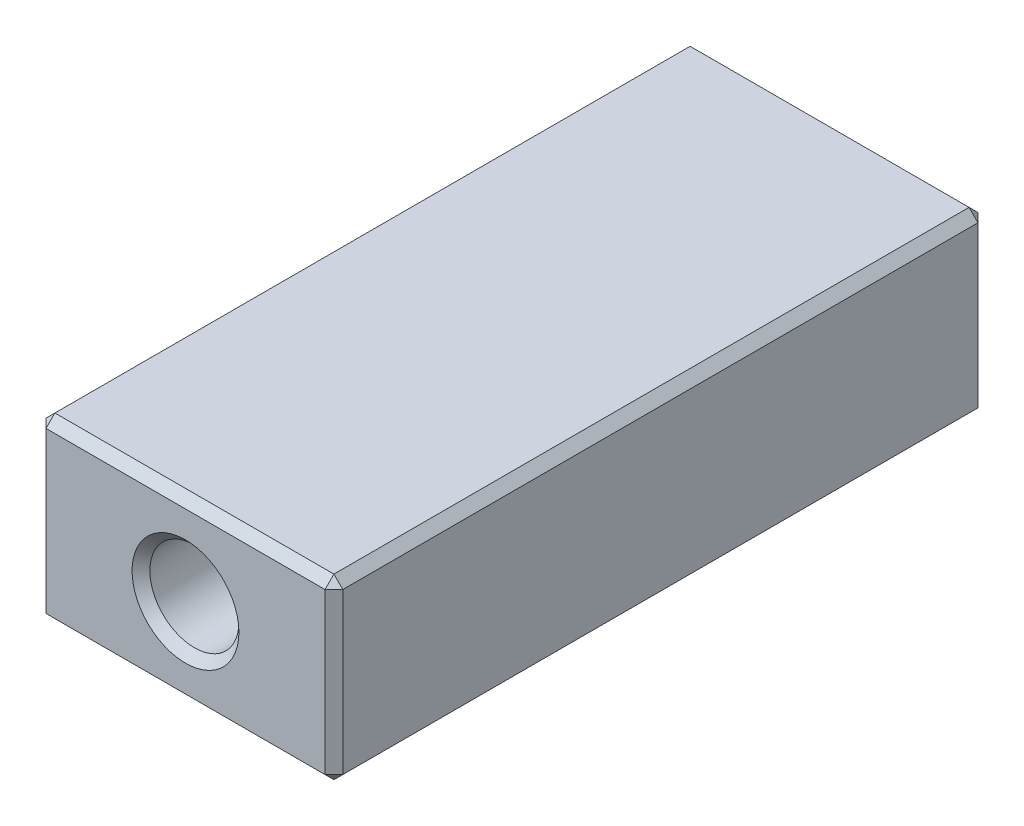
ISO-10303-21;
HEADER;
FILE_DESCRIPTION(('STEP AP214'),'2;1');
FILE_NAME('part.step','',(''),(''),'','','');
FILE_SCHEMA(('AUTOMOTIVE_DESIGN { 1 0 10303 214 1 1 1 1 }'));
ENDSEC;
DATA;
#1=APPLICATION_CONTEXT('core data for automotive mechanical design processes');
#2=APPLICATION_PROTOCOL_DEFINITION('international standard','automotive_design',2000,#1);
#3=PRODUCT_CONTEXT('',#1,'mechanical');
#4=PRODUCT('Part','Part','',(#3));
#5=PRODUCT_RELATED_PRODUCT_CATEGORY('part','',(#4));
#6=PRODUCT_DEFINITION_FORMATION('','',#4);
#7=PRODUCT_DEFINITION_CONTEXT('part definition',#1,'design');
#8=PRODUCT_DEFINITION('design','',#6,#7);
#9=PRODUCT_DEFINITION_SHAPE('','',#8);
#10=(LENGTH_UNIT() NAMED_UNIT(*) SI_UNIT(.MILLI.,.METRE.));
#11=(NAMED_UNIT(*) PLANE_ANGLE_UNIT() SI_UNIT($,.RADIAN.));
#12=(NAMED_UNIT(*) SI_UNIT($,.STERADIAN.) SOLID_ANGLE_UNIT());
#13=UNCERTAINTY_MEASURE_WITH_UNIT(LENGTH_MEASURE(1.E-05),#10,'distance_accuracy_value','');
#14=(GEOMETRIC_REPRESENTATION_CONTEXT(3) GLOBAL_UNCERTAINTY_ASSIGNED_CONTEXT((#13)) GLOBAL_UNIT_ASSIGNED_CONTEXT((#10,
#11,#12)) REPRESENTATION_CONTEXT('',''));
#15=CARTESIAN_POINT('',(0.,0.,0.));
#16=DIRECTION('',(0.,0.,1.));
#17=DIRECTION('',(1.,0.,0.));
#18=AXIS2_PLACEMENT_3D('',#15,#16,#17);
#19=CARTESIAN_POINT('',(5.,3.,22.));
#20=DIRECTION('',(-1.,0.,0.));
#21=DIRECTION('',(0.,-1.,0.));
#22=AXIS2_PLACEMENT_3D('',#19,#20,#21);
#23=PLANE('',#22);
#24=DIRECTION('',(0.,0.,1.));
#25=VECTOR('',#24,1.);
#26=CARTESIAN_POINT('',(5.,2.69999999999999,22.));
#27=LINE('',#26,#25);
#28=CARTESIAN_POINT('',(5.,2.69999999999999,0.300000000000002));
#29=VERTEX_POINT('',#28);
#30=CARTESIAN_POINT('',(5.,2.69999999999999,21.7));
#31=VERTEX_POINT('',#30);
#32=EDGE_CURVE('E185',#29,#31,#27,.T.);
#33=ORIENTED_EDGE('',*,*,#32,.T.);
#34=DIRECTION('',(0.,-1.,0.));
#35=VECTOR('',#34,1.);
#36=CARTESIAN_POINT('',(5.,-3.,21.7));
#37=LINE('',#36,#35);
#38=CARTESIAN_POINT('',(5.,-2.7,21.7));
#39=VERTEX_POINT('',#38);
#40=EDGE_CURVE('E133',#31,#39,#37,.T.);
#41=ORIENTED_EDGE('',*,*,#40,.T.);
#42=DIRECTION('',(0.,0.,-1.));
#43=VECTOR('',#42,1.);
#44=CARTESIAN_POINT('',(5.,-2.7,22.));
#45=LINE('',#44,#43);
#46=CARTESIAN_POINT('',(5.,-2.7,0.300000000000002));
#47=VERTEX_POINT('',#46);
#48=EDGE_CURVE('E189',#39,#47,#45,.T.);
#49=ORIENTED_EDGE('',*,*,#48,.T.);
#50=DIRECTION('',(0.,1.,0.));
#51=VECTOR('',#50,1.);
#52=CARTESIAN_POINT('',(5.,3.,0.300000000000002));
#53=LINE('',#52,#51);
#54=EDGE_CURVE('E187',#47,#29,#53,.T.);
#55=ORIENTED_EDGE('',*,*,#54,.T.);
#56=EDGE_LOOP('',(#33,#41,#49,#55));
#57=FACE_BOUND('',#56,.T.);
#58=ADVANCED_FACE('F36',(#57),#23,.F.);
#59=CARTESIAN_POINT('',(-5.,3.,22.));
#60=DIRECTION('',(0.,-1.,0.));
#61=DIRECTION('',(0.,0.,-1.));
#62=AXIS2_PLACEMENT_3D('',#59,#60,#61);
#63=PLANE('',#62);
#64=DIRECTION('',(1.,0.,0.));
#65=VECTOR('',#64,1.);
#66=CARTESIAN_POINT('',(5.,3.,21.7));
#67=LINE('',#66,#65);
#68=CARTESIAN_POINT('',(-4.7,3.,21.7));
#69=VERTEX_POINT('',#68);
#70=CARTESIAN_POINT('',(4.7,3.,21.7));
#71=VERTEX_POINT('',#70);
#72=EDGE_CURVE('E46',#69,#71,#67,.T.);
#73=ORIENTED_EDGE('',*,*,#72,.T.);
#74=DIRECTION('',(0.,0.,-1.));
#75=VECTOR('',#74,1.);
#76=CARTESIAN_POINT('',(4.7,3.,22.));
#77=LINE('',#76,#75);
#78=CARTESIAN_POINT('',(4.7,3.,0.300000000000002));
#79=VERTEX_POINT('',#78);
#80=EDGE_CURVE('E11',#71,#79,#77,.T.);
#81=ORIENTED_EDGE('',*,*,#80,.T.);
#82=DIRECTION('',(-1.,0.,0.));
#83=VECTOR('',#82,1.);
#84=CARTESIAN_POINT('',(-5.,3.,0.300000000000002));
#85=LINE('',#84,#83);
#86=CARTESIAN_POINT('',(-4.7,3.,0.300000000000002));
#87=VERTEX_POINT('',#86);
#88=EDGE_CURVE('E210',#79,#87,#85,.T.);
#89=ORIENTED_EDGE('',*,*,#88,.T.);
#90=DIRECTION('',(0.,0.,1.));
#91=VECTOR('',#90,1.);
#92=CARTESIAN_POINT('',(-4.7,3.,22.));
#93=LINE('',#92,#91);
#94=EDGE_CURVE('E57',#87,#69,#93,.T.);
#95=ORIENTED_EDGE('',*,*,#94,.T.);
#96=EDGE_LOOP('',(#73,#81,#89,#95));
#97=FACE_BOUND('',#96,.T.);
#98=ADVANCED_FACE('F348',(#97),#63,.F.);
#99=CARTESIAN_POINT('',(-5.,3.,22.));
#100=DIRECTION('',(1.,0.,0.));
#101=DIRECTION('',(0.,1.,0.));
#102=AXIS2_PLACEMENT_3D('',#99,#100,#101);
#103=PLANE('',#102);
#104=DIRECTION('',(0.,0.,1.));
#105=VECTOR('',#104,1.);
#106=CARTESIAN_POINT('',(-5.,-2.7,22.));
#107=LINE('',#106,#105);
#108=CARTESIAN_POINT('',(-5.,-2.7,0.300000000000002));
#109=VERTEX_POINT('',#108);
#110=CARTESIAN_POINT('',(-5.,-2.7,21.7));
#111=VERTEX_POINT('',#110);
#112=EDGE_CURVE('E205',#109,#111,#107,.T.);
#113=ORIENTED_EDGE('',*,*,#112,.T.);
#114=DIRECTION('',(0.,1.,0.));
#115=VECTOR('',#114,1.);
#116=CARTESIAN_POINT('',(-5.,3.,21.7));
#117=LINE('',#116,#115);
#118=CARTESIAN_POINT('',(-5.,2.69999999999999,21.7));
#119=VERTEX_POINT('',#118);
#120=EDGE_CURVE('E207',#111,#119,#117,.T.);
#121=ORIENTED_EDGE('',*,*,#120,.T.);
#122=DIRECTION('',(0.,0.,-1.));
#123=VECTOR('',#122,1.);
#124=CARTESIAN_POINT('',(-5.,2.69999999999999,22.));
#125=LINE('',#124,#123);
#126=CARTESIAN_POINT('',(-5.,2.69999999999999,0.300000000000002));
#127=VERTEX_POINT('',#126);
#128=EDGE_CURVE('E201',#119,#127,#125,.T.);
#129=ORIENTED_EDGE('',*,*,#128,.T.);
#130=DIRECTION('',(0.,-1.,0.));
#131=VECTOR('',#130,1.);
#132=CARTESIAN_POINT('',(-5.,3.,0.300000000000002));
#133=LINE('',#132,#131);
#134=EDGE_CURVE('E203',#127,#109,#133,.T.);
#135=ORIENTED_EDGE('',*,*,#134,.T.);
#136=EDGE_LOOP('',(#113,#121,#129,#135));
#137=FACE_BOUND('',#136,.T.);
#138=ADVANCED_FACE('F296',(#137),#103,.F.);
#139=CARTESIAN_POINT('',(-5.,-3.,22.));
#140=DIRECTION('',(0.,1.,0.));
#141=DIRECTION('',(0.,0.,1.));
#142=AXIS2_PLACEMENT_3D('',#139,#140,#141);
#143=PLANE('',#142);
#144=DIRECTION('',(0.,0.,1.));
#145=VECTOR('',#144,1.);
#146=CARTESIAN_POINT('',(4.69999999999999,-3.,22.));
#147=LINE('',#146,#145);
#148=CARTESIAN_POINT('',(4.69999999999999,-3.,0.300000000000002));
#149=VERTEX_POINT('',#148);
#150=CARTESIAN_POINT('',(4.69999999999999,-3.,21.7));
#151=VERTEX_POINT('',#150);
#152=EDGE_CURVE('E196',#149,#151,#147,.T.);
#153=ORIENTED_EDGE('',*,*,#152,.T.);
#154=DIRECTION('',(-1.,0.,0.));
#155=VECTOR('',#154,1.);
#156=CARTESIAN_POINT('',(-5.,-3.,21.7));
#157=LINE('',#156,#155);
#158=CARTESIAN_POINT('',(-4.7,-3.,21.7));
#159=VERTEX_POINT('',#158);
#160=EDGE_CURVE('E198',#151,#159,#157,.T.);
#161=ORIENTED_EDGE('',*,*,#160,.T.);
#162=DIRECTION('',(0.,0.,-1.));
#163=VECTOR('',#162,1.);
#164=CARTESIAN_POINT('',(-4.7,-3.,22.));
#165=LINE('',#164,#163);
#166=CARTESIAN_POINT('',(-4.7,-3.,0.300000000000002));
#167=VERTEX_POINT('',#166);
#168=EDGE_CURVE('E194',#159,#167,#165,.T.);
#169=ORIENTED_EDGE('',*,*,#168,.T.);
#170=DIRECTION('',(1.,0.,0.));
#171=VECTOR('',#170,1.);
#172=CARTESIAN_POINT('',(-5.,-3.,0.300000000000002));
#173=LINE('',#172,#171);
#174=EDGE_CURVE('E192',#167,#149,#173,.T.);
#175=ORIENTED_EDGE('',*,*,#174,.T.);
#176=EDGE_LOOP('',(#153,#161,#169,#175));
#177=FACE_BOUND('',#176,.T.);
#178=ADVANCED_FACE('F287',(#177),#143,.F.);
#179=CARTESIAN_POINT('',(0.,0.,22.));
#180=DIRECTION('',(0.,0.,1.));
#181=DIRECTION('',(1.,0.,0.));
#182=AXIS2_PLACEMENT_3D('',#179,#180,#181);
#183=PLANE('',#182);
#184=CARTESIAN_POINT('',(0.,0.,22.));
#185=DIRECTION('',(0.,0.,1.));
#186=DIRECTION('',(1.,0.,0.));
#187=AXIS2_PLACEMENT_3D('',#184,#185,#186);
#188=CIRCLE('',#187,1.8);
#189=CARTESIAN_POINT('',(1.8,0.,22.));
#190=VERTEX_POINT('',#189);
#191=EDGE_CURVE('E160',#190,#190,#188,.F.);
#192=ORIENTED_EDGE('',*,*,#191,.T.);
#193=EDGE_LOOP('',(#192));
#194=FACE_BOUND('',#193,.T.);
#195=DIRECTION('',(1.,0.,0.));
#196=VECTOR('',#195,1.);
#197=CARTESIAN_POINT('',(5.,-2.7,22.));
#198=LINE('',#197,#196);
#199=CARTESIAN_POINT('',(-4.7,-2.7,22.));
#200=VERTEX_POINT('',#199);
#201=CARTESIAN_POINT('',(4.7,-2.7,22.));
#202=VERTEX_POINT('',#201);
#203=EDGE_CURVE('E158',#200,#202,#198,.T.);
#204=ORIENTED_EDGE('',*,*,#203,.T.);
#205=DIRECTION('',(0.,1.,0.));
#206=VECTOR('',#205,1.);
#207=CARTESIAN_POINT('',(4.7,3.,22.));
#208=LINE('',#207,#206);
#209=CARTESIAN_POINT('',(4.7,2.69999999999999,22.));
#210=VERTEX_POINT('',#209);
#211=EDGE_CURVE('E131',#202,#210,#208,.T.);
#212=ORIENTED_EDGE('',*,*,#211,.T.);
#213=DIRECTION('',(-1.,0.,0.));
#214=VECTOR('',#213,1.);
#215=CARTESIAN_POINT('',(-5.,2.69999999999999,22.));
#216=LINE('',#215,#214);
#217=CARTESIAN_POINT('',(-4.7,2.69999999999999,22.));
#218=VERTEX_POINT('',#217);
#219=EDGE_CURVE('E148',#210,#218,#216,.T.);
#220=ORIENTED_EDGE('',*,*,#219,.T.);
#221=DIRECTION('',(0.,-1.,0.));
#222=VECTOR('',#221,1.);
#223=CARTESIAN_POINT('',(-4.7,-3.,22.));
#224=LINE('',#223,#222);
#225=EDGE_CURVE('E154',#218,#200,#224,.T.);
#226=ORIENTED_EDGE('',*,*,#225,.T.);
#227=EDGE_LOOP('',(#204,#212,#220,#226));
#228=FACE_BOUND('',#227,.T.);
#229=ADVANCED_FACE('F156',(#194,#228),#183,.T.);
#230=CARTESIAN_POINT('',(0.,0.,0.));
#231=DIRECTION('',(0.,0.,1.));
#232=DIRECTION('',(1.,0.,0.));
#233=AXIS2_PLACEMENT_3D('',#230,#231,#232);
#234=PLANE('',#233);
#235=CARTESIAN_POINT('',(0.,0.,0.));
#236=DIRECTION('',(0.,0.,1.));
#237=DIRECTION('',(1.,0.,0.));
#238=AXIS2_PLACEMENT_3D('',#235,#236,#237);
#239=CIRCLE('',#238,1.8);
#240=CARTESIAN_POINT('',(-1.8,0.,0.));
#241=VERTEX_POINT('',#240);
#242=EDGE_CURVE('E182',#241,#241,#239,.T.);
#243=ORIENTED_EDGE('',*,*,#242,.T.);
#244=EDGE_LOOP('',(#243));
#245=FACE_BOUND('',#244,.T.);
#246=DIRECTION('',(-1.,0.,0.));
#247=VECTOR('',#246,1.);
#248=CARTESIAN_POINT('',(0.,-2.7,0.));
#249=LINE('',#248,#247);
#250=CARTESIAN_POINT('',(4.7,-2.7,0.));
#251=VERTEX_POINT('',#250);
#252=CARTESIAN_POINT('',(-4.69999999999999,-2.7,0.));
#253=VERTEX_POINT('',#252);
#254=EDGE_CURVE('E177',#251,#253,#249,.T.);
#255=ORIENTED_EDGE('',*,*,#254,.T.);
#256=DIRECTION('',(0.,1.,0.));
#257=VECTOR('',#256,1.);
#258=CARTESIAN_POINT('',(-4.7,0.,0.));
#259=LINE('',#258,#257);
#260=CARTESIAN_POINT('',(-4.7,2.69999999999999,0.));
#261=VERTEX_POINT('',#260);
#262=EDGE_CURVE('E179',#253,#261,#259,.T.);
#263=ORIENTED_EDGE('',*,*,#262,.T.);
#264=DIRECTION('',(1.,0.,0.));
#265=VECTOR('',#264,1.);
#266=CARTESIAN_POINT('',(0.,2.69999999999999,0.));
#267=LINE('',#266,#265);
#268=CARTESIAN_POINT('',(4.69999999999999,2.69999999999999,0.));
#269=VERTEX_POINT('',#268);
#270=EDGE_CURVE('E173',#261,#269,#267,.T.);
#271=ORIENTED_EDGE('',*,*,#270,.T.);
#272=DIRECTION('',(0.,-1.,0.));
#273=VECTOR('',#272,1.);
#274=CARTESIAN_POINT('',(4.69999999999999,0.,0.));
#275=LINE('',#274,#273);
#276=EDGE_CURVE('E175',#269,#251,#275,.T.);
#277=ORIENTED_EDGE('',*,*,#276,.T.);
#278=EDGE_LOOP('',(#255,#263,#271,#277));
#279=FACE_BOUND('',#278,.T.);
#280=ADVANCED_FACE('F307',(#245,#279),#234,.F.);
#281=CARTESIAN_POINT('',(0.,0.,22.));
#282=DIRECTION('',(0.,0.,-1.));
#283=DIRECTION('',(-1.,0.,0.));
#284=AXIS2_PLACEMENT_3D('',#281,#282,#283);
#285=CYLINDRICAL_SURFACE('',#284,1.5);
#286=CARTESIAN_POINT('',(0.,0.,21.7));
#287=DIRECTION('',(0.,0.,1.));
#288=DIRECTION('',(1.,0.,0.));
#289=AXIS2_PLACEMENT_3D('',#286,#287,#288);
#290=CIRCLE('',#289,1.5);
#291=CARTESIAN_POINT('',(-1.5,0.,21.7));
#292=VERTEX_POINT('',#291);
#293=EDGE_CURVE('E170',#292,#292,#290,.T.);
#294=CARTESIAN_POINT('',(0.,0.,0.300000000000005));
#295=DIRECTION('',(0.,0.,1.));
#296=DIRECTION('',(1.,0.,0.));
#297=AXIS2_PLACEMENT_3D('',#294,#295,#296);
#298=CIRCLE('',#297,1.5);
#299=CARTESIAN_POINT('',(-1.5,0.,0.300000000000002));
#300=VERTEX_POINT('',#299);
#301=EDGE_CURVE('E163',#300,#300,#298,.F.);
#302=CARTESIAN_POINT('',(-1.5,0.,21.7));
#303=CARTESIAN_POINT('',(-1.5,0.,21.4770833333333));
#304=CARTESIAN_POINT('',(-1.5,0.,21.2541666666667));
#305=CARTESIAN_POINT('',(-1.5,0.,20.8083333333333));
#306=CARTESIAN_POINT('',(-1.5,0.,20.5854166666667));
#307=CARTESIAN_POINT('',(-1.5,0.,20.1395833333333));
#308=CARTESIAN_POINT('',(-1.5,0.,19.9166666666667));
#309=CARTESIAN_POINT('',(-1.5,0.,19.4708333333333));
#310=CARTESIAN_POINT('',(-1.5,0.,19.2479166666667));
#311=CARTESIAN_POINT('',(-1.5,0.,18.8020833333333));
#312=CARTESIAN_POINT('',(-1.5,0.,18.5791666666667));
#313=CARTESIAN_POINT('',(-1.5,0.,18.1333333333333));
#314=CARTESIAN_POINT('',(-1.5,0.,17.9104166666667));
#315=CARTESIAN_POINT('',(-1.5,0.,17.4645833333333));
#316=CARTESIAN_POINT('',(-1.5,0.,17.2416666666667));
#317=CARTESIAN_POINT('',(-1.5,0.,16.7958333333333));
#318=CARTESIAN_POINT('',(-1.5,0.,16.5729166666667));
#319=CARTESIAN_POINT('',(-1.5,0.,16.1270833333333));
#320=CARTESIAN_POINT('',(-1.5,0.,15.9041666666667));
#321=CARTESIAN_POINT('',(-1.5,0.,15.4583333333333));
#322=CARTESIAN_POINT('',(-1.5,0.,15.2354166666667));
#323=CARTESIAN_POINT('',(-1.5,0.,14.7895833333333));
#324=CARTESIAN_POINT('',(-1.5,0.,14.5666666666667));
#325=CARTESIAN_POINT('',(-1.5,0.,14.1208333333333));
#326=CARTESIAN_POINT('',(-1.5,0.,13.8979166666667));
#327=CARTESIAN_POINT('',(-1.5,0.,13.4520833333333));
#328=CARTESIAN_POINT('',(-1.5,0.,13.2291666666667));
#329=CARTESIAN_POINT('',(-1.5,0.,12.7833333333333));
#330=CARTESIAN_POINT('',(-1.5,0.,12.5604166666667));
#331=CARTESIAN_POINT('',(-1.5,0.,12.1145833333333));
#332=CARTESIAN_POINT('',(-1.5,0.,11.8916666666667));
#333=CARTESIAN_POINT('',(-1.5,0.,11.4458333333333));
#334=CARTESIAN_POINT('',(-1.5,0.,11.2229166666667));
#335=CARTESIAN_POINT('',(-1.5,0.,10.7770833333333));
#336=CARTESIAN_POINT('',(-1.5,0.,10.5541666666667));
#337=CARTESIAN_POINT('',(-1.5,0.,10.1083333333333));
#338=CARTESIAN_POINT('',(-1.5,0.,9.88541666666667));
#339=CARTESIAN_POINT('',(-1.5,0.,9.43958333333333));
#340=CARTESIAN_POINT('',(-1.5,0.,9.21666666666667));
#341=CARTESIAN_POINT('',(-1.5,0.,8.77083333333333));
#342=CARTESIAN_POINT('',(-1.5,0.,8.54791666666667));
#343=CARTESIAN_POINT('',(-1.5,0.,8.10208333333333));
#344=CARTESIAN_POINT('',(-1.5,0.,7.87916666666667));
#345=CARTESIAN_POINT('',(-1.5,0.,7.43333333333333));
#346=CARTESIAN_POINT('',(-1.5,0.,7.21041666666667));
#347=CARTESIAN_POINT('',(-1.5,0.,6.76458333333333));
#348=CARTESIAN_POINT('',(-1.5,0.,6.54166666666667));
#349=CARTESIAN_POINT('',(-1.5,0.,6.09583333333333));
#350=CARTESIAN_POINT('',(-1.5,0.,5.87291666666667));
#351=CARTESIAN_POINT('',(-1.5,0.,5.42708333333333));
#352=CARTESIAN_POINT('',(-1.5,0.,5.20416666666667));
#353=CARTESIAN_POINT('',(-1.5,0.,4.75833333333333));
#354=CARTESIAN_POINT('',(-1.5,0.,4.53541666666667));
#355=CARTESIAN_POINT('',(-1.5,0.,4.08958333333334));
#356=CARTESIAN_POINT('',(-1.5,0.,3.86666666666667));
#357=CARTESIAN_POINT('',(-1.5,0.,3.42083333333333));
#358=CARTESIAN_POINT('',(-1.5,0.,3.19791666666667));
#359=CARTESIAN_POINT('',(-1.5,0.,2.75208333333333));
#360=CARTESIAN_POINT('',(-1.5,0.,2.52916666666667));
#361=CARTESIAN_POINT('',(-1.5,0.,2.08333333333334));
#362=CARTESIAN_POINT('',(-1.5,0.,1.86041666666667));
#363=CARTESIAN_POINT('',(-1.5,0.,1.41458333333333));
#364=CARTESIAN_POINT('',(-1.5,0.,1.19166666666667));
#365=CARTESIAN_POINT('',(-1.5,0.,0.745833333333337));
#366=CARTESIAN_POINT('',(-1.5,0.,0.522916666666669));
#367=CARTESIAN_POINT('',(-1.5,0.,0.300000000000002));
#368=B_SPLINE_CURVE_WITH_KNOTS('',3,(#302,#303,#304,#305,#306,#307,#308,#309,#310,#311,#312,
#313,#314,#315,#316,#317,#318,#319,#320,#321,#322,#323,#324,#325,#326,#327,#328,#329,#330,#331,
#332,#333,#334,#335,#336,#337,#338,#339,#340,#341,#342,#343,#344,#345,#346,#347,#348,#349,#350,
#351,#352,#353,#354,#355,#356,#357,#358,#359,#360,#361,#362,#363,#364,#365,#366,#367),
.UNSPECIFIED.,.F.,.F.,(4,2,2,2,2,2,2,2,2,2,2,2,2,2,2,2,2,2,2,2,2,2,2,2,2,2,2,2,2,2,2,2,4),(0.,
0.668749999999999,1.3375,2.00625,2.675,3.34375,4.01249999999999,4.68125,5.34999999999999,
6.01875,6.6875,7.35624999999999,8.02499999999999,8.69374999999999,9.36249999999999,10.03125,
10.7,11.36875,12.0375,12.70625,13.375,14.04375,14.7125,15.38125,16.05,16.71875,17.3875,18.05625,
18.725,19.39375,20.0625,20.73125,21.4),.UNSPECIFIED.);
#369=EDGE_CURVE('BSEAM364',#292,#300,#368,.T.);
#370=ORIENTED_EDGE('',*,*,#293,.T.);
#371=ORIENTED_EDGE('',*,*,#301,.T.);
#372=ORIENTED_EDGE('',*,*,#369,.T.);
#373=ORIENTED_EDGE('',*,*,#369,.F.);
#374=EDGE_LOOP('',(#370,#372,#371,#373));
#375=FACE_BOUND('',#374,.T.);
#376=ADVANCED_FACE('F364',(#375),#285,.F.);
#377=CARTESIAN_POINT('',(0.,0.,22.));
#378=DIRECTION('',(0.,0.,1.));
#379=DIRECTION('',(1.,0.,0.));
#380=AXIS2_PLACEMENT_3D('',#377,#378,#379);
#381=CONICAL_SURFACE('',#380,1.8,0.785398163397444);
#382=ORIENTED_EDGE('',*,*,#293,.F.);
#383=EDGE_LOOP('',(#382));
#384=FACE_BOUND('',#383,.T.);
#385=ORIENTED_EDGE('',*,*,#191,.F.);
#386=EDGE_LOOP('',(#385));
#387=FACE_BOUND('',#386,.T.);
#388=ADVANCED_FACE('F357',(#384,#387),#381,.F.);
#389=CARTESIAN_POINT('',(0.,0.,0.300000000000005));
#390=DIRECTION('',(0.,0.,-1.));
#391=DIRECTION('',(-1.,0.,0.));
#392=AXIS2_PLACEMENT_3D('',#389,#390,#391);
#393=CONICAL_SURFACE('',#392,1.5,0.785398163397445);
#394=CARTESIAN_POINT('',(-1.8,0.,0.));
#395=CARTESIAN_POINT('',(-1.796875,0.,0.00312499999999997));
#396=CARTESIAN_POINT('',(-1.79375,0.,0.00625000000000003));
#397=CARTESIAN_POINT('',(-1.7875,0.,0.0125000000000001));
#398=CARTESIAN_POINT('',(-1.784375,0.,0.0156250000000002));
#399=CARTESIAN_POINT('',(-1.778125,0.,0.0218750000000003));
#400=CARTESIAN_POINT('',(-1.775,0.,0.0250000000000004));
#401=CARTESIAN_POINT('',(-1.76875,0.,0.0312500000000005));
#402=CARTESIAN_POINT('',(-1.765625,0.,0.0343750000000005));
#403=CARTESIAN_POINT('',(-1.759375,0.,0.0406250000000006));
#404=CARTESIAN_POINT('',(-1.75625,0.,0.0437500000000007));
#405=CARTESIAN_POINT('',(-1.75,0.,0.0500000000000008));
#406=CARTESIAN_POINT('',(-1.746875,0.,0.0531250000000008));
#407=CARTESIAN_POINT('',(-1.740625,0.,0.0593750000000009));
#408=CARTESIAN_POINT('',(-1.7375,0.,0.062500000000001));
#409=CARTESIAN_POINT('',(-1.73125,0.,0.0687500000000011));
#410=CARTESIAN_POINT('',(-1.728125,0.,0.0718750000000012));
#411=CARTESIAN_POINT('',(-1.721875,0.,0.0781250000000013));
#412=CARTESIAN_POINT('',(-1.71875,0.,0.0812500000000013));
#413=CARTESIAN_POINT('',(-1.7125,0.,0.0875000000000015));
#414=CARTESIAN_POINT('',(-1.709375,0.,0.0906250000000015));
#415=CARTESIAN_POINT('',(-1.703125,0.,0.0968750000000016));
#416=CARTESIAN_POINT('',(-1.7,0.,0.100000000000002));
#417=CARTESIAN_POINT('',(-1.69375,0.,0.106250000000002));
#418=CARTESIAN_POINT('',(-1.690625,0.,0.109375000000002));
#419=CARTESIAN_POINT('',(-1.684375,0.,0.115625000000002));
#420=CARTESIAN_POINT('',(-1.68125,0.,0.118750000000002));
#421=CARTESIAN_POINT('',(-1.675,0.,0.125000000000002));
#422=CARTESIAN_POINT('',(-1.671875,0.,0.128125000000002));
#423=CARTESIAN_POINT('',(-1.665625,0.,0.134375000000002));
#424=CARTESIAN_POINT('',(-1.6625,0.,0.137500000000002));
#425=CARTESIAN_POINT('',(-1.65625,0.,0.143750000000002));
#426=CARTESIAN_POINT('',(-1.653125,0.,0.146875000000002));
#427=CARTESIAN_POINT('',(-1.646875,0.,0.153125000000003));
#428=CARTESIAN_POINT('',(-1.64375,0.,0.156250000000003));
#429=CARTESIAN_POINT('',(-1.6375,0.,0.162500000000003));
#430=CARTESIAN_POINT('',(-1.634375,0.,0.165625000000003));
#431=CARTESIAN_POINT('',(-1.628125,0.,0.171875000000003));
#432=CARTESIAN_POINT('',(-1.625,0.,0.175000000000003));
#433=CARTESIAN_POINT('',(-1.61875,0.,0.181250000000003));
#434=CARTESIAN_POINT('',(-1.615625,0.,0.184375000000003));
#435=CARTESIAN_POINT('',(-1.609375,0.,0.190625000000003));
#436=CARTESIAN_POINT('',(-1.60625,0.,0.193750000000003));
#437=CARTESIAN_POINT('',(-1.6,0.,0.200000000000003));
#438=CARTESIAN_POINT('',(-1.596875,0.,0.203125000000003));
#439=CARTESIAN_POINT('',(-1.590625,0.,0.209375000000004));
#440=CARTESIAN_POINT('',(-1.5875,0.,0.212500000000004));
#441=CARTESIAN_POINT('',(-1.58125,0.,0.218750000000004));
#442=CARTESIAN_POINT('',(-1.578125,0.,0.221875000000004));
#443=CARTESIAN_POINT('',(-1.571875,0.,0.228125000000004));
#444=CARTESIAN_POINT('',(-1.56875,0.,0.231250000000004));
#445=CARTESIAN_POINT('',(-1.5625,0.,0.237500000000004));
#446=CARTESIAN_POINT('',(-1.559375,0.,0.240625000000004));
#447=CARTESIAN_POINT('',(-1.553125,0.,0.246875000000004));
#448=CARTESIAN_POINT('',(-1.55,0.,0.250000000000004));
#449=CARTESIAN_POINT('',(-1.54375,0.,0.256250000000004));
#450=CARTESIAN_POINT('',(-1.540625,0.,0.259375000000004));
#451=CARTESIAN_POINT('',(-1.534375,0.,0.265625000000004));
#452=CARTESIAN_POINT('',(-1.53125,0.,0.268750000000005));
#453=CARTESIAN_POINT('',(-1.525,0.,0.275000000000005));
#454=CARTESIAN_POINT('',(-1.521875,0.,0.278125000000005));
#455=CARTESIAN_POINT('',(-1.515625,0.,0.284375000000005));
#456=CARTESIAN_POINT('',(-1.5125,0.,0.287500000000005));
#457=CARTESIAN_POINT('',(-1.50625,0.,0.293750000000005));
#458=CARTESIAN_POINT('',(-1.503125,0.,0.296875000000005));
#459=CARTESIAN_POINT('',(-1.5,0.,0.300000000000005));
#460=B_SPLINE_CURVE_WITH_KNOTS('',3,(#394,#395,#396,#397,#398,#399,#400,#401,#402,#403,#404,
#405,#406,#407,#408,#409,#410,#411,#412,#413,#414,#415,#416,#417,#418,#419,#420,#421,#422,#423,
#424,#425,#426,#427,#428,#429,#430,#431,#432,#433,#434,#435,#436,#437,#438,#439,#440,#441,#442,
#443,#444,#445,#446,#447,#448,#449,#450,#451,#452,#453,#454,#455,#456,#457,#458,#459),
.UNSPECIFIED.,.F.,.F.,(4,2,2,2,2,2,2,2,2,2,2,2,2,2,2,2,2,2,2,2,2,2,2,2,2,2,2,2,2,2,2,2,4),(0.,
0.0132582521472481,0.026516504294496,0.0397747564417439,0.0530330085889918,0.0662912607362397,
0.0795495128834878,0.0928077650307357,0.106066017177984,0.119324269325232,0.132582521472479,
0.145840773619728,0.159099025766975,0.172357277914223,0.185615530061471,0.198873782208719,
0.212132034355967,0.225390286503215,0.238648538650463,0.251906790797711,0.265165042944959,
0.278423295092207,0.291681547239455,0.304939799386703,0.318198051533951,0.331456303681199,
0.344714555828447,0.357972807975695,0.371231060122942,0.38448931227019,0.397747564417438,
0.411005816564686,0.424264068711934),.UNSPECIFIED.);
#461=EDGE_CURVE('BSEAM363',#241,#300,#460,.T.);
#462=ORIENTED_EDGE('',*,*,#242,.F.);
#463=ORIENTED_EDGE('',*,*,#301,.F.);
#464=ORIENTED_EDGE('',*,*,#461,.T.);
#465=ORIENTED_EDGE('',*,*,#461,.F.);
#466=EDGE_LOOP('',(#462,#464,#463,#465));
#467=FACE_BOUND('',#466,.T.);
#468=ADVANCED_FACE('F363',(#467),#393,.F.);
#469=CARTESIAN_POINT('',(-5.,3.,0.300000000000002));
#470=DIRECTION('',(0.707106781186544,0.,0.707106781186551));
#471=DIRECTION('',(0.,-1.,0.));
#472=AXIS2_PLACEMENT_3D('',#469,#470,#471);
#473=PLANE('',#472);
#474=DIRECTION('',(-0.707106781186551,0.,0.707106781186544));
#475=VECTOR('',#474,1.);
#476=CARTESIAN_POINT('',(-4.85,-2.69999999999999,0.150000000000001));
#477=LINE('',#476,#475);
#478=EDGE_CURVE('E41',#109,#253,#477,.F.);
#479=ORIENTED_EDGE('',*,*,#478,.F.);
#480=ORIENTED_EDGE('',*,*,#134,.F.);
#481=DIRECTION('',(0.707106781186551,0.,-0.707106781186544));
#482=VECTOR('',#481,1.);
#483=CARTESIAN_POINT('',(-4.7,2.69999999999999,0.));
#484=LINE('',#483,#482);
#485=EDGE_CURVE('E263',#261,#127,#484,.F.);
#486=ORIENTED_EDGE('',*,*,#485,.F.);
#487=ORIENTED_EDGE('',*,*,#262,.F.);
#488=EDGE_LOOP('',(#479,#480,#486,#487));
#489=FACE_BOUND('',#488,.T.);
#490=ADVANCED_FACE('F39',(#489),#473,.F.);
#491=CARTESIAN_POINT('',(-4.7,-3.,0.300000000000002));
#492=DIRECTION('',(-0.577350269189626,-0.577350269189619,-0.577350269189633));
#493=DIRECTION('',(-0.707106781186552,0.,0.707106781186543));
#494=AXIS2_PLACEMENT_3D('',#491,#492,#493);
#495=PLANE('',#494);
#496=DIRECTION('',(0.707106781186543,-0.707106781186552,0.));
#497=VECTOR('',#496,1.);
#498=CARTESIAN_POINT('',(-4.7,-3.,0.300000000000002));
#499=LINE('',#498,#497);
#500=EDGE_CURVE('E258',#109,#167,#499,.T.);
#501=ORIENTED_EDGE('',*,*,#500,.F.);
#502=ORIENTED_EDGE('',*,*,#478,.T.);
#503=DIRECTION('',(0.,0.707106781186551,-0.707106781186543));
#504=VECTOR('',#503,1.);
#505=CARTESIAN_POINT('',(-4.7,-3.,0.300000000000002));
#506=LINE('',#505,#504);
#507=EDGE_CURVE('E261',#167,#253,#506,.T.);
#508=ORIENTED_EDGE('',*,*,#507,.F.);
#509=EDGE_LOOP('',(#501,#502,#508));
#510=FACE_BOUND('',#509,.T.);
#511=ADVANCED_FACE('F274',(#510),#495,.T.);
#512=CARTESIAN_POINT('',(-4.7,2.69999999999999,0.));
#513=DIRECTION('',(-0.577350269189626,0.577350269189619,-0.577350269189632));
#514=DIRECTION('',(-0.707106781186552,0.,0.707106781186543));
#515=AXIS2_PLACEMENT_3D('',#512,#513,#514);
#516=PLANE('',#515);
#517=DIRECTION('',(0.,0.707106781186551,0.707106781186543));
#518=VECTOR('',#517,1.);
#519=CARTESIAN_POINT('',(-4.7,2.69999999999999,0.));
#520=LINE('',#519,#518);
#521=EDGE_CURVE('E252',#261,#87,#520,.T.);
#522=ORIENTED_EDGE('',*,*,#521,.F.);
#523=ORIENTED_EDGE('',*,*,#485,.T.);
#524=DIRECTION('',(-0.707106781186543,-0.707106781186551,0.));
#525=VECTOR('',#524,1.);
#526=CARTESIAN_POINT('',(-4.85,2.85,0.300000000000002));
#527=LINE('',#526,#525);
#528=EDGE_CURVE('E255',#87,#127,#527,.T.);
#529=ORIENTED_EDGE('',*,*,#528,.F.);
#530=EDGE_LOOP('',(#522,#523,#529));
#531=FACE_BOUND('',#530,.T.);
#532=ADVANCED_FACE('F447',(#531),#516,.T.);
#533=CARTESIAN_POINT('',(-5.,-3.,0.300000000000002));
#534=DIRECTION('',(0.,0.707106781186544,0.707106781186552));
#535=DIRECTION('',(1.,0.,0.));
#536=AXIS2_PLACEMENT_3D('',#533,#534,#535);
#537=PLANE('',#536);
#538=ORIENTED_EDGE('',*,*,#507,.T.);
#539=ORIENTED_EDGE('',*,*,#254,.F.);
#540=DIRECTION('',(0.,-0.707106781186552,0.707106781186543));
#541=VECTOR('',#540,1.);
#542=CARTESIAN_POINT('',(4.7,-2.85,0.15));
#543=LINE('',#542,#541);
#544=EDGE_CURVE('E246',#149,#251,#543,.F.);
#545=ORIENTED_EDGE('',*,*,#544,.F.);
#546=ORIENTED_EDGE('',*,*,#174,.F.);
#547=EDGE_LOOP('',(#538,#539,#545,#546));
#548=FACE_BOUND('',#547,.T.);
#549=ADVANCED_FACE('F282',(#548),#537,.F.);
#550=CARTESIAN_POINT('',(-4.7,-3.,22.));
#551=DIRECTION('',(0.707106781186552,0.707106781186544,0.));
#552=DIRECTION('',(0.,0.,-1.));
#553=AXIS2_PLACEMENT_3D('',#550,#551,#552);
#554=PLANE('',#553);
#555=ORIENTED_EDGE('',*,*,#500,.T.);
#556=ORIENTED_EDGE('',*,*,#168,.F.);
#557=DIRECTION('',(-0.707106781186544,0.707106781186552,0.));
#558=VECTOR('',#557,1.);
#559=CARTESIAN_POINT('',(-4.7,-3.,21.7));
#560=LINE('',#559,#558);
#561=EDGE_CURVE('E243',#111,#159,#560,.F.);
#562=ORIENTED_EDGE('',*,*,#561,.F.);
#563=ORIENTED_EDGE('',*,*,#112,.F.);
#564=EDGE_LOOP('',(#555,#556,#562,#563));
#565=FACE_BOUND('',#564,.T.);
#566=ADVANCED_FACE('F293',(#565),#554,.F.);
#567=CARTESIAN_POINT('',(-4.7,0.,22.));
#568=DIRECTION('',(-0.707106781186552,0.,0.707106781186543));
#569=DIRECTION('',(0.,1.,0.));
#570=AXIS2_PLACEMENT_3D('',#567,#568,#569);
#571=PLANE('',#570);
#572=DIRECTION('',(0.707106781186543,0.,0.707106781186552));
#573=VECTOR('',#572,1.);
#574=CARTESIAN_POINT('',(-5.,2.69999999999999,21.7));
#575=LINE('',#574,#573);
#576=EDGE_CURVE('E237',#119,#218,#575,.T.);
#577=ORIENTED_EDGE('',*,*,#576,.F.);
#578=ORIENTED_EDGE('',*,*,#120,.F.);
#579=DIRECTION('',(-0.707106781186543,0.,-0.707106781186552));
#580=VECTOR('',#579,1.);
#581=CARTESIAN_POINT('',(-4.85,-2.7,21.85));
#582=LINE('',#581,#580);
#583=EDGE_CURVE('E240',#200,#111,#582,.T.);
#584=ORIENTED_EDGE('',*,*,#583,.F.);
#585=ORIENTED_EDGE('',*,*,#225,.F.);
#586=EDGE_LOOP('',(#577,#578,#584,#585));
#587=FACE_BOUND('',#586,.T.);
#588=ADVANCED_FACE('F300',(#587),#571,.T.);
#589=CARTESIAN_POINT('',(-5.,2.69999999999999,22.));
#590=DIRECTION('',(0.707106781186552,-0.707106781186544,0.));
#591=DIRECTION('',(0.,0.,-1.));
#592=AXIS2_PLACEMENT_3D('',#589,#590,#591);
#593=PLANE('',#592);
#594=ORIENTED_EDGE('',*,*,#528,.T.);
#595=ORIENTED_EDGE('',*,*,#128,.F.);
#596=DIRECTION('',(0.707106781186543,0.707106781186551,0.));
#597=VECTOR('',#596,1.);
#598=CARTESIAN_POINT('',(-5.,2.69999999999999,21.7));
#599=LINE('',#598,#597);
#600=EDGE_CURVE('E235',#69,#119,#599,.F.);
#601=ORIENTED_EDGE('',*,*,#600,.F.);
#602=ORIENTED_EDGE('',*,*,#94,.F.);
#603=EDGE_LOOP('',(#594,#595,#601,#602));
#604=FACE_BOUND('',#603,.T.);
#605=ADVANCED_FACE('F305',(#604),#593,.F.);
#606=CARTESIAN_POINT('',(-5.,3.,0.300000000000002));
#607=DIRECTION('',(0.,-0.707106781186544,0.707106781186552));
#608=DIRECTION('',(-1.,0.,0.));
#609=AXIS2_PLACEMENT_3D('',#606,#607,#608);
#610=PLANE('',#609);
#611=ORIENTED_EDGE('',*,*,#521,.T.);
#612=ORIENTED_EDGE('',*,*,#88,.F.);
#613=DIRECTION('',(0.,-0.707106781186551,-0.707106781186543));
#614=VECTOR('',#613,1.);
#615=CARTESIAN_POINT('',(4.7,2.85,0.150000000000001));
#616=LINE('',#615,#614);
#617=EDGE_CURVE('E232',#269,#79,#616,.F.);
#618=ORIENTED_EDGE('',*,*,#617,.F.);
#619=ORIENTED_EDGE('',*,*,#270,.F.);
#620=EDGE_LOOP('',(#611,#612,#618,#619));
#621=FACE_BOUND('',#620,.T.);
#622=ADVANCED_FACE('F317',(#621),#610,.F.);
#623=CARTESIAN_POINT('',(5.,3.,0.300000000000002));
#624=DIRECTION('',(-0.707106781186544,0.,0.707106781186552));
#625=DIRECTION('',(0.,1.,0.));
#626=AXIS2_PLACEMENT_3D('',#623,#624,#625);
#627=PLANE('',#626);
#628=DIRECTION('',(-0.707106781186551,0.,-0.707106781186543));
#629=VECTOR('',#628,1.);
#630=CARTESIAN_POINT('',(5.,-2.7,0.300000000000002));
#631=LINE('',#630,#629);
#632=EDGE_CURVE('E249',#251,#47,#631,.F.);
#633=ORIENTED_EDGE('',*,*,#632,.F.);
#634=ORIENTED_EDGE('',*,*,#276,.F.);
#635=DIRECTION('',(0.707106781186551,0.,0.707106781186543));
#636=VECTOR('',#635,1.);
#637=CARTESIAN_POINT('',(5.,2.69999999999999,0.300000000000002));
#638=LINE('',#637,#636);
#639=EDGE_CURVE('E229',#29,#269,#638,.F.);
#640=ORIENTED_EDGE('',*,*,#639,.F.);
#641=ORIENTED_EDGE('',*,*,#54,.F.);
#642=EDGE_LOOP('',(#633,#634,#640,#641));
#643=FACE_BOUND('',#642,.T.);
#644=ADVANCED_FACE('F312',(#643),#627,.F.);
#645=CARTESIAN_POINT('',(5.,-2.7,0.300000000000002));
#646=DIRECTION('',(0.577350269189619,-0.577350269189627,-0.577350269189632));
#647=DIRECTION('',(0.,0.707106781186551,-0.707106781186544));
#648=AXIS2_PLACEMENT_3D('',#645,#646,#647);
#649=PLANE('',#648);
#650=ORIENTED_EDGE('',*,*,#544,.T.);
#651=ORIENTED_EDGE('',*,*,#632,.T.);
#652=DIRECTION('',(0.707106781186553,0.707106781186542,0.));
#653=VECTOR('',#652,1.);
#654=CARTESIAN_POINT('',(5.,-2.7,0.300000000000002));
#655=LINE('',#654,#653);
#656=EDGE_CURVE('E226',#149,#47,#655,.T.);
#657=ORIENTED_EDGE('',*,*,#656,.F.);
#658=EDGE_LOOP('',(#650,#651,#657));
#659=FACE_BOUND('',#658,.T.);
#660=ADVANCED_FACE('F326',(#659),#649,.T.);
#661=CARTESIAN_POINT('',(-4.7,-3.,21.7));
#662=DIRECTION('',(-0.577350269189633,-0.577350269189626,0.577350269189618));
#663=DIRECTION('',(0.707106781186544,-0.707106781186552,0.));
#664=AXIS2_PLACEMENT_3D('',#661,#662,#663);
#665=PLANE('',#664);
#666=ORIENTED_EDGE('',*,*,#583,.T.);
#667=ORIENTED_EDGE('',*,*,#561,.T.);
#668=DIRECTION('',(0.,0.707106781186543,0.707106781186551));
#669=VECTOR('',#668,1.);
#670=CARTESIAN_POINT('',(-4.7,-3.,21.7));
#671=LINE('',#670,#669);
#672=EDGE_CURVE('E224',#200,#159,#671,.F.);
#673=ORIENTED_EDGE('',*,*,#672,.F.);
#674=EDGE_LOOP('',(#666,#667,#673));
#675=FACE_BOUND('',#674,.T.);
#676=ADVANCED_FACE('F336',(#675),#665,.T.);
#677=CARTESIAN_POINT('',(-5.,2.69999999999999,21.7));
#678=DIRECTION('',(-0.577350269189633,0.57735026918962,0.577350269189625));
#679=DIRECTION('',(0.707106781186542,0.,0.707106781186553));
#680=AXIS2_PLACEMENT_3D('',#677,#678,#679);
#681=PLANE('',#680);
#682=ORIENTED_EDGE('',*,*,#600,.T.);
#683=ORIENTED_EDGE('',*,*,#576,.T.);
#684=DIRECTION('',(0.,0.707106781186551,-0.707106781186543));
#685=VECTOR('',#684,1.);
#686=CARTESIAN_POINT('',(-4.7,2.85,21.85));
#687=LINE('',#686,#685);
#688=EDGE_CURVE('E151',#69,#218,#687,.F.);
#689=ORIENTED_EDGE('',*,*,#688,.F.);
#690=EDGE_LOOP('',(#682,#683,#689));
#691=FACE_BOUND('',#690,.T.);
#692=ADVANCED_FACE('F338',(#691),#681,.T.);
#693=CARTESIAN_POINT('',(5.,2.69999999999999,0.300000000000002));
#694=DIRECTION('',(0.577350269189626,0.577350269189619,-0.577350269189632));
#695=DIRECTION('',(-0.707106781186552,0.,-0.707106781186543));
#696=AXIS2_PLACEMENT_3D('',#693,#694,#695);
#697=PLANE('',#696);
#698=ORIENTED_EDGE('',*,*,#639,.T.);
#699=ORIENTED_EDGE('',*,*,#617,.T.);
#700=DIRECTION('',(-0.707106781186543,0.707106781186551,0.));
#701=VECTOR('',#700,1.);
#702=CARTESIAN_POINT('',(5.,2.69999999999999,0.300000000000002));
#703=LINE('',#702,#701);
#704=EDGE_CURVE('E221',#29,#79,#703,.T.);
#705=ORIENTED_EDGE('',*,*,#704,.F.);
#706=EDGE_LOOP('',(#698,#699,#705));
#707=FACE_BOUND('',#706,.T.);
#708=ADVANCED_FACE('F319',(#707),#697,.T.);
#709=CARTESIAN_POINT('',(5.,-2.7,22.));
#710=DIRECTION('',(-0.707106781186542,0.707106781186553,0.));
#711=DIRECTION('',(0.,0.,-1.));
#712=AXIS2_PLACEMENT_3D('',#709,#710,#711);
#713=PLANE('',#712);
#714=ORIENTED_EDGE('',*,*,#656,.T.);
#715=ORIENTED_EDGE('',*,*,#48,.F.);
#716=DIRECTION('',(-0.707106781186552,-0.707106781186542,0.));
#717=VECTOR('',#716,1.);
#718=CARTESIAN_POINT('',(5.,-2.7,21.7));
#719=LINE('',#718,#717);
#720=EDGE_CURVE('E218',#151,#39,#719,.F.);
#721=ORIENTED_EDGE('',*,*,#720,.F.);
#722=ORIENTED_EDGE('',*,*,#152,.F.);
#723=EDGE_LOOP('',(#714,#715,#721,#722));
#724=FACE_BOUND('',#723,.T.);
#725=ADVANCED_FACE('F328',(#724),#713,.F.);
#726=CARTESIAN_POINT('',(0.,-2.7,22.));
#727=DIRECTION('',(0.,-0.707106781186552,0.707106781186544));
#728=DIRECTION('',(-1.,0.,0.));
#729=AXIS2_PLACEMENT_3D('',#726,#727,#728);
#730=PLANE('',#729);
#731=ORIENTED_EDGE('',*,*,#672,.T.);
#732=ORIENTED_EDGE('',*,*,#160,.F.);
#733=DIRECTION('',(0.,-0.707106781186543,-0.707106781186552));
#734=VECTOR('',#733,1.);
#735=CARTESIAN_POINT('',(4.7,-2.85,21.85));
#736=LINE('',#735,#734);
#737=EDGE_CURVE('E145',#202,#151,#736,.T.);
#738=ORIENTED_EDGE('',*,*,#737,.F.);
#739=ORIENTED_EDGE('',*,*,#203,.F.);
#740=EDGE_LOOP('',(#731,#732,#738,#739));
#741=FACE_BOUND('',#740,.T.);
#742=ADVANCED_FACE('F334',(#741),#730,.T.);
#743=CARTESIAN_POINT('',(0.,2.69999999999999,22.));
#744=DIRECTION('',(0.,0.707106781186544,0.707106781186552));
#745=DIRECTION('',(1.,0.,0.));
#746=AXIS2_PLACEMENT_3D('',#743,#744,#745);
#747=PLANE('',#746);
#748=ORIENTED_EDGE('',*,*,#688,.T.);
#749=ORIENTED_EDGE('',*,*,#219,.F.);
#750=DIRECTION('',(0.,-0.707106781186552,0.707106781186543));
#751=VECTOR('',#750,1.);
#752=CARTESIAN_POINT('',(4.7,2.69999999999999,22.));
#753=LINE('',#752,#751);
#754=EDGE_CURVE('E139',#71,#210,#753,.T.);
#755=ORIENTED_EDGE('',*,*,#754,.F.);
#756=ORIENTED_EDGE('',*,*,#72,.F.);
#757=EDGE_LOOP('',(#748,#749,#755,#756));
#758=FACE_BOUND('',#757,.T.);
#759=ADVANCED_FACE('F149',(#758),#747,.T.);
#760=CARTESIAN_POINT('',(4.7,3.,22.));
#761=DIRECTION('',(-0.707106781186552,-0.707106781186544,0.));
#762=DIRECTION('',(0.,0.,-1.));
#763=AXIS2_PLACEMENT_3D('',#760,#761,#762);
#764=PLANE('',#763);
#765=ORIENTED_EDGE('',*,*,#704,.T.);
#766=ORIENTED_EDGE('',*,*,#80,.F.);
#767=DIRECTION('',(0.707106781186543,-0.707106781186552,0.));
#768=VECTOR('',#767,1.);
#769=CARTESIAN_POINT('',(4.85,2.85,21.7));
#770=LINE('',#769,#768);
#771=EDGE_CURVE('E143',#31,#71,#770,.F.);
#772=ORIENTED_EDGE('',*,*,#771,.F.);
#773=ORIENTED_EDGE('',*,*,#32,.F.);
#774=EDGE_LOOP('',(#765,#766,#772,#773));
#775=FACE_BOUND('',#774,.T.);
#776=ADVANCED_FACE('F322',(#775),#764,.F.);
#777=CARTESIAN_POINT('',(5.,-2.7,21.7));
#778=DIRECTION('',(0.577350269189625,-0.577350269189634,0.577350269189619));
#779=DIRECTION('',(0.707106781186553,0.707106781186542,0.));
#780=AXIS2_PLACEMENT_3D('',#777,#778,#779);
#781=PLANE('',#780);
#782=ORIENTED_EDGE('',*,*,#737,.T.);
#783=ORIENTED_EDGE('',*,*,#720,.T.);
#784=DIRECTION('',(-0.707106781186543,0.,0.707106781186552));
#785=VECTOR('',#784,1.);
#786=CARTESIAN_POINT('',(5.,-2.7,21.7));
#787=LINE('',#786,#785);
#788=EDGE_CURVE('E136',#202,#39,#787,.F.);
#789=ORIENTED_EDGE('',*,*,#788,.F.);
#790=EDGE_LOOP('',(#782,#783,#789));
#791=FACE_BOUND('',#790,.T.);
#792=ADVANCED_FACE('F332',(#791),#781,.T.);
#793=CARTESIAN_POINT('',(4.7,2.69999999999999,22.));
#794=DIRECTION('',(0.577350269189633,0.577350269189619,0.577350269189626));
#795=DIRECTION('',(0.707106781186543,0.,-0.707106781186552));
#796=AXIS2_PLACEMENT_3D('',#793,#794,#795);
#797=PLANE('',#796);
#798=ORIENTED_EDGE('',*,*,#771,.T.);
#799=ORIENTED_EDGE('',*,*,#754,.T.);
#800=DIRECTION('',(0.707106781186544,0.,-0.707106781186552));
#801=VECTOR('',#800,1.);
#802=CARTESIAN_POINT('',(4.7,2.69999999999999,22.));
#803=LINE('',#802,#801);
#804=EDGE_CURVE('E127',#31,#210,#803,.F.);
#805=ORIENTED_EDGE('',*,*,#804,.F.);
#806=EDGE_LOOP('',(#798,#799,#805));
#807=FACE_BOUND('',#806,.T.);
#808=ADVANCED_FACE('F141',(#807),#797,.T.);
#809=CARTESIAN_POINT('',(4.7,0.,22.));
#810=DIRECTION('',(0.707106781186552,0.,0.707106781186544));
#811=DIRECTION('',(0.,-1.,0.));
#812=AXIS2_PLACEMENT_3D('',#809,#810,#811);
#813=PLANE('',#812);
#814=ORIENTED_EDGE('',*,*,#788,.T.);
#815=ORIENTED_EDGE('',*,*,#40,.F.);
#816=ORIENTED_EDGE('',*,*,#804,.T.);
#817=ORIENTED_EDGE('',*,*,#211,.F.);
#818=EDGE_LOOP('',(#814,#815,#816,#817));
#819=FACE_BOUND('',#818,.T.);
#820=ADVANCED_FACE('F129',(#819),#813,.T.);
#821=CLOSED_SHELL('',(#58,#98,#138,#178,#229,#280,#376,#388,#468,#490,#511,#532,#549,#566,#588,
#605,#622,#644,#660,#676,#692,#708,#725,#742,#759,#776,#792,#808,#820));
#822=MANIFOLD_SOLID_BREP('B2',#821);
#823=ADVANCED_BREP_SHAPE_REPRESENTATION('',(#18,#822),#14);
#824=SHAPE_DEFINITION_REPRESENTATION(#9,#823);
ENDSEC;
END-ISO-10303-21;
